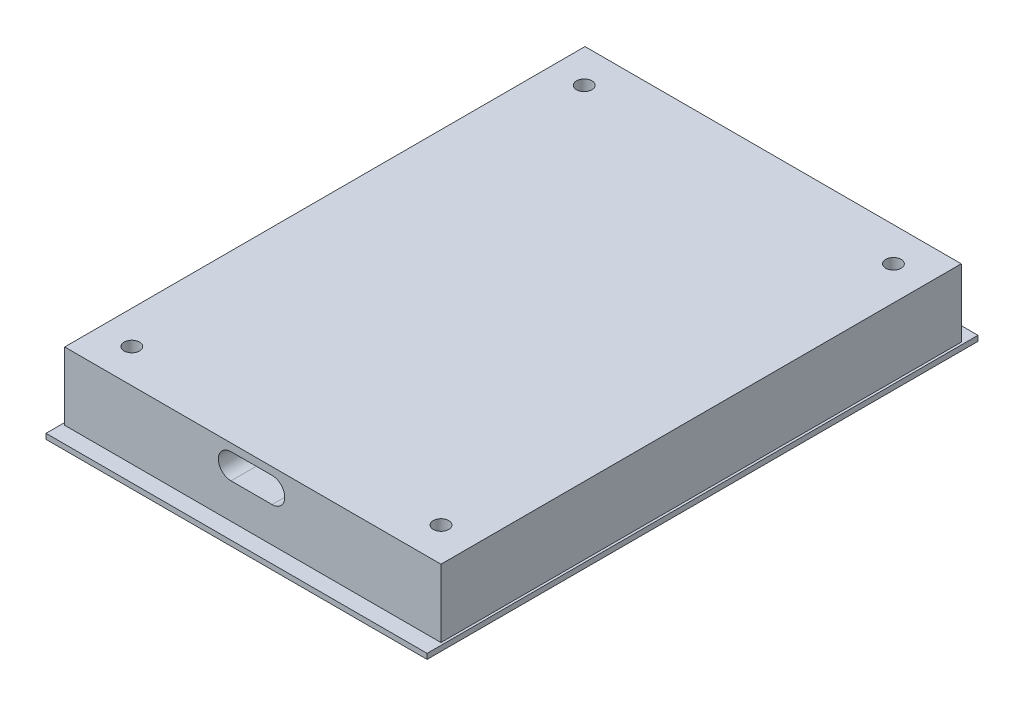
ISO-10303-21;
HEADER;
FILE_DESCRIPTION(('STEP AP214'),'2;1');
FILE_NAME('part.step','',(''),(''),'','','');
FILE_SCHEMA(('AUTOMOTIVE_DESIGN { 1 0 10303 214 1 1 1 1 }'));
ENDSEC;
DATA;
#1=APPLICATION_CONTEXT('core data for automotive mechanical design processes');
#2=APPLICATION_PROTOCOL_DEFINITION('international standard','automotive_design',2000,#1);
#3=PRODUCT_CONTEXT('',#1,'mechanical');
#4=PRODUCT('Part','Part','',(#3));
#5=PRODUCT_RELATED_PRODUCT_CATEGORY('part','',(#4));
#6=PRODUCT_DEFINITION_FORMATION('','',#4);
#7=PRODUCT_DEFINITION_CONTEXT('part definition',#1,'design');
#8=PRODUCT_DEFINITION('design','',#6,#7);
#9=PRODUCT_DEFINITION_SHAPE('','',#8);
#10=(LENGTH_UNIT() NAMED_UNIT(*) SI_UNIT(.MILLI.,.METRE.));
#11=(NAMED_UNIT(*) PLANE_ANGLE_UNIT() SI_UNIT($,.RADIAN.));
#12=(NAMED_UNIT(*) SI_UNIT($,.STERADIAN.) SOLID_ANGLE_UNIT());
#13=UNCERTAINTY_MEASURE_WITH_UNIT(LENGTH_MEASURE(1.E-05),#10,'distance_accuracy_value','');
#14=(GEOMETRIC_REPRESENTATION_CONTEXT(3) GLOBAL_UNCERTAINTY_ASSIGNED_CONTEXT((#13)) GLOBAL_UNIT_ASSIGNED_CONTEXT((#10,
#11,#12)) REPRESENTATION_CONTEXT('',''));
#15=CARTESIAN_POINT('',(0.,0.,0.));
#16=DIRECTION('',(0.,0.,1.));
#17=DIRECTION('',(1.,0.,0.));
#18=AXIS2_PLACEMENT_3D('',#15,#16,#17);
#19=CARTESIAN_POINT('',(0.,0.7,0.));
#20=DIRECTION('',(0.,-1.,0.));
#21=DIRECTION('',(0.,0.,-1.));
#22=AXIS2_PLACEMENT_3D('',#19,#20,#21);
#23=PLANE('',#22);
#24=DIRECTION('',(0.,0.,-1.));
#25=VECTOR('',#24,1.);
#26=CARTESIAN_POINT('',(25.27,0.7,36.53));
#27=LINE('',#26,#25);
#28=CARTESIAN_POINT('',(25.27,0.7,36.53));
#29=VERTEX_POINT('',#28);
#30=CARTESIAN_POINT('',(25.27,0.7,-36.53));
#31=VERTEX_POINT('',#30);
#32=EDGE_CURVE('E232',#29,#31,#27,.T.);
#33=ORIENTED_EDGE('',*,*,#32,.T.);
#34=DIRECTION('',(-1.,0.,0.));
#35=VECTOR('',#34,1.);
#36=CARTESIAN_POINT('',(-25.27,0.7,-36.53));
#37=LINE('',#36,#35);
#38=CARTESIAN_POINT('',(-25.27,0.7,-36.53));
#39=VERTEX_POINT('',#38);
#40=EDGE_CURVE('E235',#31,#39,#37,.T.);
#41=ORIENTED_EDGE('',*,*,#40,.T.);
#42=DIRECTION('',(0.,0.,1.));
#43=VECTOR('',#42,1.);
#44=CARTESIAN_POINT('',(-25.27,0.7,36.53));
#45=LINE('',#44,#43);
#46=CARTESIAN_POINT('',(-25.27,0.7,36.53));
#47=VERTEX_POINT('',#46);
#48=EDGE_CURVE('E238',#39,#47,#45,.T.);
#49=ORIENTED_EDGE('',*,*,#48,.T.);
#50=DIRECTION('',(1.,0.,0.));
#51=VECTOR('',#50,1.);
#52=CARTESIAN_POINT('',(-25.27,0.7,36.53));
#53=LINE('',#52,#51);
#54=EDGE_CURVE('E240',#47,#29,#53,.T.);
#55=ORIENTED_EDGE('',*,*,#54,.T.);
#56=EDGE_LOOP('',(#33,#41,#49,#55));
#57=FACE_BOUND('',#56,.T.);
#58=DIRECTION('',(0.,0.,-1.));
#59=VECTOR('',#58,1.);
#60=CARTESIAN_POINT('',(24.95,0.7,-34.63));
#61=LINE('',#60,#59);
#62=CARTESIAN_POINT('',(24.95,0.7,34.37));
#63=VERTEX_POINT('',#62);
#64=CARTESIAN_POINT('',(24.95,0.7,-34.63));
#65=VERTEX_POINT('',#64);
#66=EDGE_CURVE('E62',#63,#65,#61,.T.);
#67=ORIENTED_EDGE('',*,*,#66,.F.);
#68=DIRECTION('',(1.,0.,0.));
#69=VECTOR('',#68,1.);
#70=CARTESIAN_POINT('',(-24.95,0.7,34.37));
#71=LINE('',#70,#69);
#72=CARTESIAN_POINT('',(-24.95,0.7,34.37));
#73=VERTEX_POINT('',#72);
#74=EDGE_CURVE('E205',#73,#63,#71,.T.);
#75=ORIENTED_EDGE('',*,*,#74,.F.);
#76=DIRECTION('',(0.,0.,1.));
#77=VECTOR('',#76,1.);
#78=CARTESIAN_POINT('',(-24.95,0.7,-34.63));
#79=LINE('',#78,#77);
#80=CARTESIAN_POINT('',(-24.95,0.7,-34.63));
#81=VERTEX_POINT('',#80);
#82=EDGE_CURVE('E216',#81,#73,#79,.T.);
#83=ORIENTED_EDGE('',*,*,#82,.F.);
#84=DIRECTION('',(-1.,0.,0.));
#85=VECTOR('',#84,1.);
#86=CARTESIAN_POINT('',(-24.95,0.7,-34.63));
#87=LINE('',#86,#85);
#88=EDGE_CURVE('E213',#65,#81,#87,.T.);
#89=ORIENTED_EDGE('',*,*,#88,.F.);
#90=EDGE_LOOP('',(#67,#75,#83,#89));
#91=FACE_BOUND('',#90,.T.);
#92=ADVANCED_FACE('F39',(#57,#91),#23,.F.);
#93=CARTESIAN_POINT('',(25.27,0.7,36.53));
#94=DIRECTION('',(-1.,0.,0.));
#95=DIRECTION('',(0.,0.,1.));
#96=AXIS2_PLACEMENT_3D('',#93,#94,#95);
#97=PLANE('',#96);
#98=DIRECTION('',(0.,0.,-1.));
#99=VECTOR('',#98,1.);
#100=CARTESIAN_POINT('',(25.27,0.,36.53));
#101=LINE('',#100,#99);
#102=CARTESIAN_POINT('',(25.27,0.,36.53));
#103=VERTEX_POINT('',#102);
#104=CARTESIAN_POINT('',(25.27,0.,-36.53));
#105=VERTEX_POINT('',#104);
#106=EDGE_CURVE('E231',#103,#105,#101,.T.);
#107=ORIENTED_EDGE('',*,*,#106,.T.);
#108=DIRECTION('',(0.,-1.,0.));
#109=VECTOR('',#108,1.);
#110=CARTESIAN_POINT('',(25.27,0.7,-36.53));
#111=LINE('',#110,#109);
#112=EDGE_CURVE('E11',#31,#105,#111,.T.);
#113=ORIENTED_EDGE('',*,*,#112,.F.);
#114=ORIENTED_EDGE('',*,*,#32,.F.);
#115=DIRECTION('',(0.,-1.,0.));
#116=VECTOR('',#115,1.);
#117=CARTESIAN_POINT('',(25.27,0.7,36.53));
#118=LINE('',#117,#116);
#119=EDGE_CURVE('E242',#29,#103,#118,.T.);
#120=ORIENTED_EDGE('',*,*,#119,.T.);
#121=EDGE_LOOP('',(#107,#113,#114,#120));
#122=FACE_BOUND('',#121,.T.);
#123=ADVANCED_FACE('F41',(#122),#97,.F.);
#124=CARTESIAN_POINT('',(-25.27,0.7,-36.53));
#125=DIRECTION('',(0.,0.,1.));
#126=DIRECTION('',(1.,0.,0.));
#127=AXIS2_PLACEMENT_3D('',#124,#125,#126);
#128=PLANE('',#127);
#129=DIRECTION('',(-1.,0.,0.));
#130=VECTOR('',#129,1.);
#131=CARTESIAN_POINT('',(-25.27,0.,-36.53));
#132=LINE('',#131,#130);
#133=CARTESIAN_POINT('',(-25.27,0.,-36.53));
#134=VERTEX_POINT('',#133);
#135=EDGE_CURVE('E245',#105,#134,#132,.T.);
#136=ORIENTED_EDGE('',*,*,#135,.T.);
#137=DIRECTION('',(0.,-1.,0.));
#138=VECTOR('',#137,1.);
#139=CARTESIAN_POINT('',(-25.27,0.7,-36.53));
#140=LINE('',#139,#138);
#141=EDGE_CURVE('E47',#39,#134,#140,.T.);
#142=ORIENTED_EDGE('',*,*,#141,.F.);
#143=ORIENTED_EDGE('',*,*,#40,.F.);
#144=ORIENTED_EDGE('',*,*,#112,.T.);
#145=EDGE_LOOP('',(#136,#142,#143,#144));
#146=FACE_BOUND('',#145,.T.);
#147=ADVANCED_FACE('F274',(#146),#128,.F.);
#148=CARTESIAN_POINT('',(-25.27,0.7,36.53));
#149=DIRECTION('',(1.,0.,0.));
#150=DIRECTION('',(0.,0.,-1.));
#151=AXIS2_PLACEMENT_3D('',#148,#149,#150);
#152=PLANE('',#151);
#153=DIRECTION('',(0.,0.,1.));
#154=VECTOR('',#153,1.);
#155=CARTESIAN_POINT('',(-25.27,0.,36.53));
#156=LINE('',#155,#154);
#157=CARTESIAN_POINT('',(-25.27,0.,36.53));
#158=VERTEX_POINT('',#157);
#159=EDGE_CURVE('E247',#134,#158,#156,.T.);
#160=ORIENTED_EDGE('',*,*,#159,.T.);
#161=DIRECTION('',(0.,-1.,0.));
#162=VECTOR('',#161,1.);
#163=CARTESIAN_POINT('',(-25.27,0.7,36.53));
#164=LINE('',#163,#162);
#165=EDGE_CURVE('E252',#47,#158,#164,.T.);
#166=ORIENTED_EDGE('',*,*,#165,.F.);
#167=ORIENTED_EDGE('',*,*,#48,.F.);
#168=ORIENTED_EDGE('',*,*,#141,.T.);
#169=EDGE_LOOP('',(#160,#166,#167,#168));
#170=FACE_BOUND('',#169,.T.);
#171=ADVANCED_FACE('F259',(#170),#152,.F.);
#172=CARTESIAN_POINT('',(-25.27,0.7,36.53));
#173=DIRECTION('',(0.,0.,-1.));
#174=DIRECTION('',(-1.,0.,0.));
#175=AXIS2_PLACEMENT_3D('',#172,#173,#174);
#176=PLANE('',#175);
#177=DIRECTION('',(1.,0.,0.));
#178=VECTOR('',#177,1.);
#179=CARTESIAN_POINT('',(-25.27,0.,36.53));
#180=LINE('',#179,#178);
#181=EDGE_CURVE('E236',#158,#103,#180,.T.);
#182=ORIENTED_EDGE('',*,*,#181,.T.);
#183=ORIENTED_EDGE('',*,*,#119,.F.);
#184=ORIENTED_EDGE('',*,*,#54,.F.);
#185=ORIENTED_EDGE('',*,*,#165,.T.);
#186=EDGE_LOOP('',(#182,#183,#184,#185));
#187=FACE_BOUND('',#186,.T.);
#188=ADVANCED_FACE('F268',(#187),#176,.F.);
#189=CARTESIAN_POINT('',(0.,0.,0.));
#190=DIRECTION('',(0.,-1.,0.));
#191=DIRECTION('',(0.,0.,-1.));
#192=AXIS2_PLACEMENT_3D('',#189,#190,#191);
#193=PLANE('',#192);
#194=ORIENTED_EDGE('',*,*,#106,.F.);
#195=ORIENTED_EDGE('',*,*,#181,.F.);
#196=ORIENTED_EDGE('',*,*,#159,.F.);
#197=ORIENTED_EDGE('',*,*,#135,.F.);
#198=EDGE_LOOP('',(#194,#195,#196,#197));
#199=FACE_BOUND('',#198,.T.);
#200=ADVANCED_FACE('F265',(#199),#193,.T.);
#201=CARTESIAN_POINT('',(24.95,9.7,-34.63));
#202=DIRECTION('',(-1.,0.,0.));
#203=DIRECTION('',(0.,0.,1.));
#204=AXIS2_PLACEMENT_3D('',#201,#202,#203);
#205=PLANE('',#204);
#206=ORIENTED_EDGE('',*,*,#66,.T.);
#207=DIRECTION('',(0.,-1.,0.));
#208=VECTOR('',#207,1.);
#209=CARTESIAN_POINT('',(24.95,9.7,-34.63));
#210=LINE('',#209,#208);
#211=CARTESIAN_POINT('',(24.95,9.7,-34.63));
#212=VERTEX_POINT('',#211);
#213=EDGE_CURVE('E228',#212,#65,#210,.T.);
#214=ORIENTED_EDGE('',*,*,#213,.F.);
#215=DIRECTION('',(0.,0.,-1.));
#216=VECTOR('',#215,1.);
#217=CARTESIAN_POINT('',(24.95,9.7,-34.63));
#218=LINE('',#217,#216);
#219=CARTESIAN_POINT('',(24.95,9.7,34.37));
#220=VERTEX_POINT('',#219);
#221=EDGE_CURVE('E201',#220,#212,#218,.T.);
#222=ORIENTED_EDGE('',*,*,#221,.F.);
#223=DIRECTION('',(0.,-1.,0.));
#224=VECTOR('',#223,1.);
#225=CARTESIAN_POINT('',(24.95,9.7,34.37));
#226=LINE('',#225,#224);
#227=EDGE_CURVE('E211',#220,#63,#226,.T.);
#228=ORIENTED_EDGE('',*,*,#227,.T.);
#229=EDGE_LOOP('',(#206,#214,#222,#228));
#230=FACE_BOUND('',#229,.T.);
#231=ADVANCED_FACE('F287',(#230),#205,.F.);
#232=CARTESIAN_POINT('',(-24.95,9.7,-34.63));
#233=DIRECTION('',(0.,0.,1.));
#234=DIRECTION('',(1.,0.,0.));
#235=AXIS2_PLACEMENT_3D('',#232,#233,#234);
#236=PLANE('',#235);
#237=ORIENTED_EDGE('',*,*,#88,.T.);
#238=DIRECTION('',(0.,-1.,0.));
#239=VECTOR('',#238,1.);
#240=CARTESIAN_POINT('',(-24.95,9.7,-34.63));
#241=LINE('',#240,#239);
#242=CARTESIAN_POINT('',(-24.95,9.7,-34.63));
#243=VERTEX_POINT('',#242);
#244=EDGE_CURVE('E225',#243,#81,#241,.T.);
#245=ORIENTED_EDGE('',*,*,#244,.F.);
#246=DIRECTION('',(-1.,0.,0.));
#247=VECTOR('',#246,1.);
#248=CARTESIAN_POINT('',(-24.95,9.7,-34.63));
#249=LINE('',#248,#247);
#250=EDGE_CURVE('E204',#212,#243,#249,.T.);
#251=ORIENTED_EDGE('',*,*,#250,.F.);
#252=ORIENTED_EDGE('',*,*,#213,.T.);
#253=EDGE_LOOP('',(#237,#245,#251,#252));
#254=FACE_BOUND('',#253,.T.);
#255=ADVANCED_FACE('F306',(#254),#236,.F.);
#256=CARTESIAN_POINT('',(-24.95,9.7,-34.63));
#257=DIRECTION('',(1.,0.,0.));
#258=DIRECTION('',(0.,0.,-1.));
#259=AXIS2_PLACEMENT_3D('',#256,#257,#258);
#260=PLANE('',#259);
#261=ORIENTED_EDGE('',*,*,#82,.T.);
#262=DIRECTION('',(0.,-1.,0.));
#263=VECTOR('',#262,1.);
#264=CARTESIAN_POINT('',(-24.95,9.7,34.37));
#265=LINE('',#264,#263);
#266=CARTESIAN_POINT('',(-24.95,9.7,34.37));
#267=VERTEX_POINT('',#266);
#268=EDGE_CURVE('E222',#267,#73,#265,.T.);
#269=ORIENTED_EDGE('',*,*,#268,.F.);
#270=DIRECTION('',(0.,0.,1.));
#271=VECTOR('',#270,1.);
#272=CARTESIAN_POINT('',(-24.95,9.7,-34.63));
#273=LINE('',#272,#271);
#274=EDGE_CURVE('E207',#243,#267,#273,.T.);
#275=ORIENTED_EDGE('',*,*,#274,.F.);
#276=ORIENTED_EDGE('',*,*,#244,.T.);
#277=EDGE_LOOP('',(#261,#269,#275,#276));
#278=FACE_BOUND('',#277,.T.);
#279=ADVANCED_FACE('F313',(#278),#260,.F.);
#280=CARTESIAN_POINT('',(-24.95,9.7,34.37));
#281=DIRECTION('',(0.,0.,-1.));
#282=DIRECTION('',(-1.,0.,0.));
#283=AXIS2_PLACEMENT_3D('',#280,#281,#282);
#284=PLANE('',#283);
#285=DIRECTION('',(1.,0.,0.));
#286=VECTOR('',#285,1.);
#287=CARTESIAN_POINT('',(-2.895,5.35,34.37));
#288=LINE('',#287,#286);
#289=CARTESIAN_POINT('',(-2.895,5.35,34.37));
#290=VERTEX_POINT('',#289);
#291=CARTESIAN_POINT('',(2.555,5.35,34.37));
#292=VERTEX_POINT('',#291);
#293=EDGE_CURVE('E186',#290,#292,#288,.T.);
#294=ORIENTED_EDGE('',*,*,#293,.F.);
#295=CARTESIAN_POINT('',(-2.895,7.025,34.37));
#296=DIRECTION('',(0.,0.,1.));
#297=DIRECTION('',(1.,0.,0.));
#298=AXIS2_PLACEMENT_3D('',#295,#296,#297);
#299=CIRCLE('',#298,1.675);
#300=CARTESIAN_POINT('',(-2.895,8.7,34.37));
#301=VERTEX_POINT('',#300);
#302=EDGE_CURVE('E54',#301,#290,#299,.T.);
#303=ORIENTED_EDGE('',*,*,#302,.F.);
#304=DIRECTION('',(-1.,0.,0.));
#305=VECTOR('',#304,1.);
#306=CARTESIAN_POINT('',(-2.895,8.7,34.37));
#307=LINE('',#306,#305);
#308=CARTESIAN_POINT('',(2.555,8.7,34.37));
#309=VERTEX_POINT('',#308);
#310=EDGE_CURVE('E175',#309,#301,#307,.T.);
#311=ORIENTED_EDGE('',*,*,#310,.F.);
#312=CARTESIAN_POINT('',(2.555,7.025,34.37));
#313=DIRECTION('',(0.,0.,1.));
#314=DIRECTION('',(1.,0.,0.));
#315=AXIS2_PLACEMENT_3D('',#312,#313,#314);
#316=CIRCLE('',#315,1.675);
#317=EDGE_CURVE('E189',#292,#309,#316,.T.);
#318=ORIENTED_EDGE('',*,*,#317,.F.);
#319=EDGE_LOOP('',(#294,#303,#311,#318));
#320=FACE_BOUND('',#319,.T.);
#321=ORIENTED_EDGE('',*,*,#74,.T.);
#322=ORIENTED_EDGE('',*,*,#227,.F.);
#323=DIRECTION('',(1.,0.,0.));
#324=VECTOR('',#323,1.);
#325=CARTESIAN_POINT('',(-24.95,9.7,34.37));
#326=LINE('',#325,#324);
#327=EDGE_CURVE('E209',#267,#220,#326,.T.);
#328=ORIENTED_EDGE('',*,*,#327,.F.);
#329=ORIENTED_EDGE('',*,*,#268,.T.);
#330=EDGE_LOOP('',(#321,#322,#328,#329));
#331=FACE_BOUND('',#330,.T.);
#332=ADVANCED_FACE('F320',(#320,#331),#284,.F.);
#333=CARTESIAN_POINT('',(0.,9.7,0.));
#334=DIRECTION('',(0.,1.,0.));
#335=DIRECTION('',(0.,0.,1.));
#336=AXIS2_PLACEMENT_3D('',#333,#334,#335);
#337=PLANE('',#336);
#338=CARTESIAN_POINT('',(-20.55,9.7,-30.13));
#339=DIRECTION('',(0.,1.,0.));
#340=DIRECTION('',(0.,0.,1.));
#341=AXIS2_PLACEMENT_3D('',#338,#339,#340);
#342=CIRCLE('',#341,1.02499999999999);
#343=CARTESIAN_POINT('',(-20.55,9.7,-29.105));
#344=VERTEX_POINT('',#343);
#345=EDGE_CURVE('E149',#344,#344,#342,.T.);
#346=ORIENTED_EDGE('',*,*,#345,.F.);
#347=EDGE_LOOP('',(#346));
#348=FACE_BOUND('',#347,.T.);
#349=CARTESIAN_POINT('',(20.45,9.7,-30.13));
#350=DIRECTION('',(0.,1.,0.));
#351=DIRECTION('',(0.,0.,1.));
#352=AXIS2_PLACEMENT_3D('',#349,#350,#351);
#353=CIRCLE('',#352,1.02499999999999);
#354=CARTESIAN_POINT('',(20.45,9.7,-29.105));
#355=VERTEX_POINT('',#354);
#356=EDGE_CURVE('E148',#355,#355,#353,.T.);
#357=ORIENTED_EDGE('',*,*,#356,.F.);
#358=EDGE_LOOP('',(#357));
#359=FACE_BOUND('',#358,.T.);
#360=CARTESIAN_POINT('',(20.45,9.7,29.87));
#361=DIRECTION('',(0.,1.,0.));
#362=DIRECTION('',(0.,0.,1.));
#363=AXIS2_PLACEMENT_3D('',#360,#361,#362);
#364=CIRCLE('',#363,1.02499999999999);
#365=CARTESIAN_POINT('',(20.45,9.7,30.895));
#366=VERTEX_POINT('',#365);
#367=EDGE_CURVE('E159',#366,#366,#364,.T.);
#368=ORIENTED_EDGE('',*,*,#367,.F.);
#369=EDGE_LOOP('',(#368));
#370=FACE_BOUND('',#369,.T.);
#371=CARTESIAN_POINT('',(-20.55,9.7,29.87));
#372=DIRECTION('',(0.,1.,0.));
#373=DIRECTION('',(0.,0.,1.));
#374=AXIS2_PLACEMENT_3D('',#371,#372,#373);
#375=CIRCLE('',#374,1.02499999999999);
#376=CARTESIAN_POINT('',(-20.55,9.7,30.895));
#377=VERTEX_POINT('',#376);
#378=EDGE_CURVE('E165',#377,#377,#375,.T.);
#379=ORIENTED_EDGE('',*,*,#378,.F.);
#380=EDGE_LOOP('',(#379));
#381=FACE_BOUND('',#380,.T.);
#382=ORIENTED_EDGE('',*,*,#221,.T.);
#383=ORIENTED_EDGE('',*,*,#250,.T.);
#384=ORIENTED_EDGE('',*,*,#274,.T.);
#385=ORIENTED_EDGE('',*,*,#327,.T.);
#386=EDGE_LOOP('',(#382,#383,#384,#385));
#387=FACE_BOUND('',#386,.T.);
#388=ADVANCED_FACE('F328',(#348,#359,#370,#381,#387),#337,.T.);
#389=CARTESIAN_POINT('',(-2.895,7.025,29.37));
#390=DIRECTION('',(0.,0.,1.));
#391=DIRECTION('',(1.,0.,0.));
#392=AXIS2_PLACEMENT_3D('',#389,#390,#391);
#393=CYLINDRICAL_SURFACE('',#392,1.675);
#394=ORIENTED_EDGE('',*,*,#302,.T.);
#395=DIRECTION('',(0.,0.,1.));
#396=VECTOR('',#395,1.);
#397=CARTESIAN_POINT('',(-2.895,5.35,29.37));
#398=LINE('',#397,#396);
#399=CARTESIAN_POINT('',(-2.895,5.35,29.37));
#400=VERTEX_POINT('',#399);
#401=EDGE_CURVE('E184',#400,#290,#398,.T.);
#402=ORIENTED_EDGE('',*,*,#401,.F.);
#403=CARTESIAN_POINT('',(-2.895,7.025,29.37));
#404=DIRECTION('',(0.,0.,1.));
#405=DIRECTION('',(1.,0.,0.));
#406=AXIS2_PLACEMENT_3D('',#403,#404,#405);
#407=CIRCLE('',#406,1.675);
#408=CARTESIAN_POINT('',(-2.895,8.7,29.37));
#409=VERTEX_POINT('',#408);
#410=EDGE_CURVE('E171',#409,#400,#407,.T.);
#411=ORIENTED_EDGE('',*,*,#410,.F.);
#412=DIRECTION('',(0.,0.,1.));
#413=VECTOR('',#412,1.);
#414=CARTESIAN_POINT('',(-2.895,8.7,29.37));
#415=LINE('',#414,#413);
#416=EDGE_CURVE('E194',#409,#301,#415,.T.);
#417=ORIENTED_EDGE('',*,*,#416,.T.);
#418=EDGE_LOOP('',(#394,#402,#411,#417));
#419=FACE_BOUND('',#418,.T.);
#420=ADVANCED_FACE('F337',(#419),#393,.F.);
#421=CARTESIAN_POINT('',(-2.895,8.7,29.37));
#422=DIRECTION('',(0.,1.,0.));
#423=DIRECTION('',(0.,0.,1.));
#424=AXIS2_PLACEMENT_3D('',#421,#422,#423);
#425=PLANE('',#424);
#426=ORIENTED_EDGE('',*,*,#310,.T.);
#427=ORIENTED_EDGE('',*,*,#416,.F.);
#428=DIRECTION('',(-1.,0.,0.));
#429=VECTOR('',#428,1.);
#430=CARTESIAN_POINT('',(-2.895,8.7,29.37));
#431=LINE('',#430,#429);
#432=CARTESIAN_POINT('',(2.555,8.7,29.37));
#433=VERTEX_POINT('',#432);
#434=EDGE_CURVE('E181',#433,#409,#431,.T.);
#435=ORIENTED_EDGE('',*,*,#434,.F.);
#436=DIRECTION('',(0.,0.,1.));
#437=VECTOR('',#436,1.);
#438=CARTESIAN_POINT('',(2.555,8.7,29.37));
#439=LINE('',#438,#437);
#440=EDGE_CURVE('E196',#433,#309,#439,.T.);
#441=ORIENTED_EDGE('',*,*,#440,.T.);
#442=EDGE_LOOP('',(#426,#427,#435,#441));
#443=FACE_BOUND('',#442,.T.);
#444=ADVANCED_FACE('F346',(#443),#425,.F.);
#445=CARTESIAN_POINT('',(2.555,7.025,29.37));
#446=DIRECTION('',(0.,0.,1.));
#447=DIRECTION('',(1.,0.,0.));
#448=AXIS2_PLACEMENT_3D('',#445,#446,#447);
#449=CYLINDRICAL_SURFACE('',#448,1.675);
#450=ORIENTED_EDGE('',*,*,#317,.T.);
#451=ORIENTED_EDGE('',*,*,#440,.F.);
#452=CARTESIAN_POINT('',(2.555,7.025,29.37));
#453=DIRECTION('',(0.,0.,1.));
#454=DIRECTION('',(1.,0.,0.));
#455=AXIS2_PLACEMENT_3D('',#452,#453,#454);
#456=CIRCLE('',#455,1.675);
#457=CARTESIAN_POINT('',(2.555,5.35,29.37));
#458=VERTEX_POINT('',#457);
#459=EDGE_CURVE('E178',#458,#433,#456,.T.);
#460=ORIENTED_EDGE('',*,*,#459,.F.);
#461=DIRECTION('',(0.,0.,1.));
#462=VECTOR('',#461,1.);
#463=CARTESIAN_POINT('',(2.555,5.35,29.37));
#464=LINE('',#463,#462);
#465=EDGE_CURVE('E198',#458,#292,#464,.T.);
#466=ORIENTED_EDGE('',*,*,#465,.T.);
#467=EDGE_LOOP('',(#450,#451,#460,#466));
#468=FACE_BOUND('',#467,.T.);
#469=ADVANCED_FACE('F353',(#468),#449,.F.);
#470=CARTESIAN_POINT('',(-2.895,5.35,29.37));
#471=DIRECTION('',(0.,-1.,0.));
#472=DIRECTION('',(1.,0.,0.));
#473=AXIS2_PLACEMENT_3D('',#470,#471,#472);
#474=PLANE('',#473);
#475=ORIENTED_EDGE('',*,*,#293,.T.);
#476=ORIENTED_EDGE('',*,*,#465,.F.);
#477=DIRECTION('',(1.,0.,0.));
#478=VECTOR('',#477,1.);
#479=CARTESIAN_POINT('',(-2.895,5.35,29.37));
#480=LINE('',#479,#478);
#481=EDGE_CURVE('E174',#400,#458,#480,.T.);
#482=ORIENTED_EDGE('',*,*,#481,.F.);
#483=ORIENTED_EDGE('',*,*,#401,.T.);
#484=EDGE_LOOP('',(#475,#476,#482,#483));
#485=FACE_BOUND('',#484,.T.);
#486=ADVANCED_FACE('F361',(#485),#474,.F.);
#487=CARTESIAN_POINT('',(-2.895,7.025,29.37));
#488=DIRECTION('',(0.,0.,1.));
#489=DIRECTION('',(1.,0.,0.));
#490=AXIS2_PLACEMENT_3D('',#487,#488,#489);
#491=PLANE('',#490);
#492=ORIENTED_EDGE('',*,*,#410,.T.);
#493=ORIENTED_EDGE('',*,*,#481,.T.);
#494=ORIENTED_EDGE('',*,*,#459,.T.);
#495=ORIENTED_EDGE('',*,*,#434,.T.);
#496=EDGE_LOOP('',(#492,#493,#494,#495));
#497=FACE_BOUND('',#496,.T.);
#498=ADVANCED_FACE('F369',(#497),#491,.T.);
#499=CARTESIAN_POINT('',(-20.55,5.06588213450325,29.87));
#500=DIRECTION('',(0.,1.,0.));
#501=DIRECTION('',(0.,0.,1.));
#502=AXIS2_PLACEMENT_3D('',#499,#500,#501);
#503=CONICAL_SURFACE('',#502,1.025,1.02974425867665);
#504=CARTESIAN_POINT('',(-20.55,4.45,29.87));
#505=VERTEX_POINT('',#504);
#506=VERTEX_LOOP('',#505);
#507=FACE_BOUND('',#506,.T.);
#508=CARTESIAN_POINT('',(-20.55,5.06588213450325,29.87));
#509=DIRECTION('',(0.,1.,0.));
#510=DIRECTION('',(0.,0.,1.));
#511=AXIS2_PLACEMENT_3D('',#508,#509,#510);
#512=CIRCLE('',#511,1.025);
#513=CARTESIAN_POINT('',(-20.55,5.06588213450325,30.895));
#514=VERTEX_POINT('',#513);
#515=EDGE_CURVE('E168',#514,#514,#512,.T.);
#516=ORIENTED_EDGE('',*,*,#515,.T.);
#517=EDGE_LOOP('',(#516));
#518=FACE_BOUND('',#517,.T.);
#519=ADVANCED_FACE('F376',(#507,#518),#503,.F.);
#520=CARTESIAN_POINT('',(-20.55,9.7,29.87));
#521=DIRECTION('',(0.,1.,0.));
#522=DIRECTION('',(0.,0.,1.));
#523=AXIS2_PLACEMENT_3D('',#520,#521,#522);
#524=CYLINDRICAL_SURFACE('',#523,1.02499999999999);
#525=ORIENTED_EDGE('',*,*,#515,.F.);
#526=EDGE_LOOP('',(#525));
#527=FACE_BOUND('',#526,.T.);
#528=ORIENTED_EDGE('',*,*,#378,.T.);
#529=EDGE_LOOP('',(#528));
#530=FACE_BOUND('',#529,.T.);
#531=ADVANCED_FACE('F383',(#527,#530),#524,.F.);
#532=CARTESIAN_POINT('',(20.45,5.06588213450325,29.87));
#533=DIRECTION('',(0.,1.,0.));
#534=DIRECTION('',(0.,0.,1.));
#535=AXIS2_PLACEMENT_3D('',#532,#533,#534);
#536=CONICAL_SURFACE('',#535,1.025,1.02974425867665);
#537=CARTESIAN_POINT('',(20.45,4.45,29.87));
#538=VERTEX_POINT('',#537);
#539=VERTEX_LOOP('',#538);
#540=FACE_BOUND('',#539,.T.);
#541=CARTESIAN_POINT('',(20.45,5.06588213450325,29.87));
#542=DIRECTION('',(0.,1.,0.));
#543=DIRECTION('',(0.,0.,1.));
#544=AXIS2_PLACEMENT_3D('',#541,#542,#543);
#545=CIRCLE('',#544,1.025);
#546=CARTESIAN_POINT('',(20.45,5.06588213450325,30.895));
#547=VERTEX_POINT('',#546);
#548=EDGE_CURVE('E162',#547,#547,#545,.T.);
#549=ORIENTED_EDGE('',*,*,#548,.T.);
#550=EDGE_LOOP('',(#549));
#551=FACE_BOUND('',#550,.T.);
#552=ADVANCED_FACE('F392',(#540,#551),#536,.F.);
#553=CARTESIAN_POINT('',(20.45,9.7,29.87));
#554=DIRECTION('',(0.,1.,0.));
#555=DIRECTION('',(0.,0.,1.));
#556=AXIS2_PLACEMENT_3D('',#553,#554,#555);
#557=CYLINDRICAL_SURFACE('',#556,1.02499999999999);
#558=ORIENTED_EDGE('',*,*,#548,.F.);
#559=EDGE_LOOP('',(#558));
#560=FACE_BOUND('',#559,.T.);
#561=ORIENTED_EDGE('',*,*,#367,.T.);
#562=EDGE_LOOP('',(#561));
#563=FACE_BOUND('',#562,.T.);
#564=ADVANCED_FACE('F401',(#560,#563),#557,.F.);
#565=CARTESIAN_POINT('',(20.45,5.06588213450325,-30.13));
#566=DIRECTION('',(0.,1.,0.));
#567=DIRECTION('',(0.,0.,1.));
#568=AXIS2_PLACEMENT_3D('',#565,#566,#567);
#569=CONICAL_SURFACE('',#568,1.025,1.02974425867665);
#570=CARTESIAN_POINT('',(20.45,4.45,-30.13));
#571=VERTEX_POINT('',#570);
#572=VERTEX_LOOP('',#571);
#573=FACE_BOUND('',#572,.T.);
#574=CARTESIAN_POINT('',(20.45,5.06588213450325,-30.13));
#575=DIRECTION('',(0.,1.,0.));
#576=DIRECTION('',(0.,0.,1.));
#577=AXIS2_PLACEMENT_3D('',#574,#575,#576);
#578=CIRCLE('',#577,1.025);
#579=CARTESIAN_POINT('',(20.45,5.06588213450325,-29.105));
#580=VERTEX_POINT('',#579);
#581=EDGE_CURVE('E152',#580,#580,#578,.T.);
#582=ORIENTED_EDGE('',*,*,#581,.T.);
#583=EDGE_LOOP('',(#582));
#584=FACE_BOUND('',#583,.T.);
#585=ADVANCED_FACE('F409',(#573,#584),#569,.F.);
#586=CARTESIAN_POINT('',(20.45,9.7,-30.13));
#587=DIRECTION('',(0.,1.,0.));
#588=DIRECTION('',(0.,0.,1.));
#589=AXIS2_PLACEMENT_3D('',#586,#587,#588);
#590=CYLINDRICAL_SURFACE('',#589,1.02499999999999);
#591=ORIENTED_EDGE('',*,*,#581,.F.);
#592=EDGE_LOOP('',(#591));
#593=FACE_BOUND('',#592,.T.);
#594=ORIENTED_EDGE('',*,*,#356,.T.);
#595=EDGE_LOOP('',(#594));
#596=FACE_BOUND('',#595,.T.);
#597=ADVANCED_FACE('F142',(#593,#596),#590,.F.);
#598=CARTESIAN_POINT('',(-20.55,5.06588213450325,-30.13));
#599=DIRECTION('',(0.,1.,0.));
#600=DIRECTION('',(0.,0.,1.));
#601=AXIS2_PLACEMENT_3D('',#598,#599,#600);
#602=CONICAL_SURFACE('',#601,1.025,1.02974425867665);
#603=CARTESIAN_POINT('',(-20.55,4.45,-30.13));
#604=VERTEX_POINT('',#603);
#605=VERTEX_LOOP('',#604);
#606=FACE_BOUND('',#605,.T.);
#607=CARTESIAN_POINT('',(-20.55,5.06588213450325,-30.13));
#608=DIRECTION('',(0.,1.,0.));
#609=DIRECTION('',(0.,0.,1.));
#610=AXIS2_PLACEMENT_3D('',#607,#608,#609);
#611=CIRCLE('',#610,1.025);
#612=CARTESIAN_POINT('',(-20.55,5.06588213450325,-29.105));
#613=VERTEX_POINT('',#612);
#614=EDGE_CURVE('E146',#613,#613,#611,.T.);
#615=ORIENTED_EDGE('',*,*,#614,.T.);
#616=EDGE_LOOP('',(#615));
#617=FACE_BOUND('',#616,.T.);
#618=ADVANCED_FACE('F138',(#606,#617),#602,.F.);
#619=CARTESIAN_POINT('',(-20.55,9.7,-30.13));
#620=DIRECTION('',(0.,1.,0.));
#621=DIRECTION('',(0.,0.,1.));
#622=AXIS2_PLACEMENT_3D('',#619,#620,#621);
#623=CYLINDRICAL_SURFACE('',#622,1.02499999999999);
#624=ORIENTED_EDGE('',*,*,#614,.F.);
#625=EDGE_LOOP('',(#624));
#626=FACE_BOUND('',#625,.T.);
#627=ORIENTED_EDGE('',*,*,#345,.T.);
#628=EDGE_LOOP('',(#627));
#629=FACE_BOUND('',#628,.T.);
#630=ADVANCED_FACE('F141',(#626,#629),#623,.F.);
#631=CLOSED_SHELL('',(#92,#123,#147,#171,#188,#200,#231,#255,#279,#332,#388,#420,#444,#469,#486,
#498,#519,#531,#552,#564,#585,#597,#618,#630));
#632=MANIFOLD_SOLID_BREP('B2',#631);
#633=ADVANCED_BREP_SHAPE_REPRESENTATION('',(#18,#632),#14);
#634=SHAPE_DEFINITION_REPRESENTATION(#9,#633);
ENDSEC;
END-ISO-10303-21;
